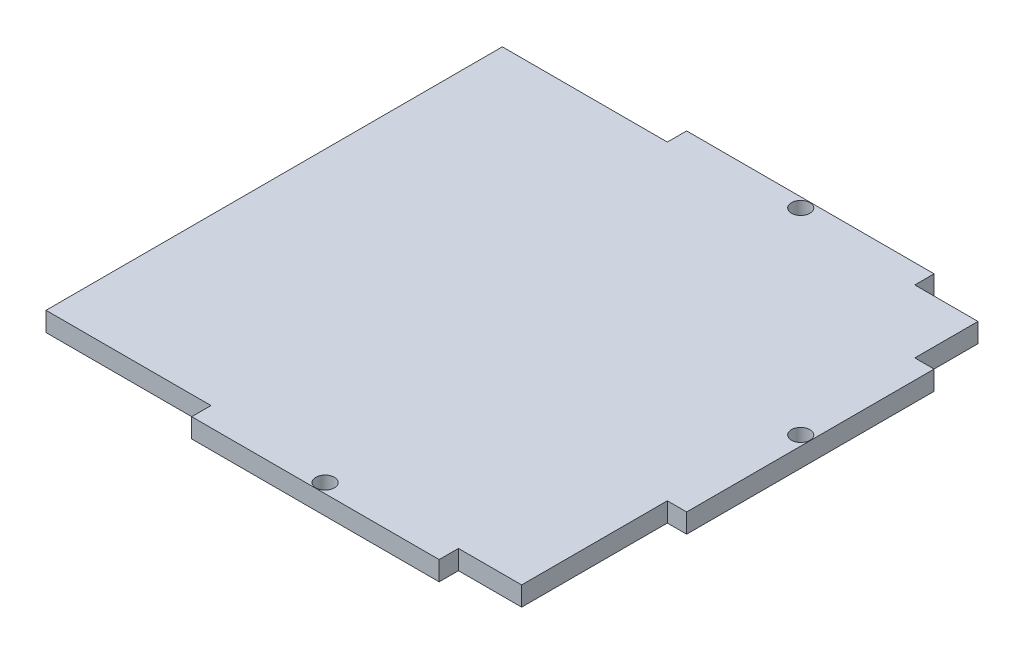
ISO-10303-21;
HEADER;
FILE_DESCRIPTION(('STEP AP214'),'2;1');
FILE_NAME('part.step','',(''),(''),'','','');
FILE_SCHEMA(('AUTOMOTIVE_DESIGN { 1 0 10303 214 1 1 1 1 }'));
ENDSEC;
DATA;
#1=APPLICATION_CONTEXT('core data for automotive mechanical design processes');
#2=APPLICATION_PROTOCOL_DEFINITION('international standard','automotive_design',2000,#1);
#3=PRODUCT_CONTEXT('',#1,'mechanical');
#4=PRODUCT('Part','Part','',(#3));
#5=PRODUCT_RELATED_PRODUCT_CATEGORY('part','',(#4));
#6=PRODUCT_DEFINITION_FORMATION('','',#4);
#7=PRODUCT_DEFINITION_CONTEXT('part definition',#1,'design');
#8=PRODUCT_DEFINITION('design','',#6,#7);
#9=PRODUCT_DEFINITION_SHAPE('','',#8);
#10=(LENGTH_UNIT() NAMED_UNIT(*) SI_UNIT(.MILLI.,.METRE.));
#11=(NAMED_UNIT(*) PLANE_ANGLE_UNIT() SI_UNIT($,.RADIAN.));
#12=(NAMED_UNIT(*) SI_UNIT($,.STERADIAN.) SOLID_ANGLE_UNIT());
#13=UNCERTAINTY_MEASURE_WITH_UNIT(LENGTH_MEASURE(1.E-05),#10,'distance_accuracy_value','');
#14=(GEOMETRIC_REPRESENTATION_CONTEXT(3) GLOBAL_UNCERTAINTY_ASSIGNED_CONTEXT((#13)) GLOBAL_UNIT_ASSIGNED_CONTEXT((#10,
#11,#12)) REPRESENTATION_CONTEXT('',''));
#15=CARTESIAN_POINT('',(0.,0.,0.));
#16=DIRECTION('',(0.,0.,1.));
#17=DIRECTION('',(1.,0.,0.));
#18=AXIS2_PLACEMENT_3D('',#15,#16,#17);
#19=CARTESIAN_POINT('',(38.1,2.9718,38.1));
#20=DIRECTION('',(-1.,0.,0.));
#21=DIRECTION('',(0.,0.,1.));
#22=AXIS2_PLACEMENT_3D('',#19,#20,#21);
#23=PLANE('',#22);
#24=DIRECTION('',(0.,0.,-1.));
#25=VECTOR('',#24,1.);
#26=CARTESIAN_POINT('',(38.1,2.9718,38.1));
#27=LINE('',#26,#25);
#28=CARTESIAN_POINT('',(38.1,2.9718,12.7));
#29=VERTEX_POINT('',#28);
#30=CARTESIAN_POINT('',(38.1,2.9718,-25.4));
#31=VERTEX_POINT('',#30);
#32=EDGE_CURVE('E226',#29,#31,#27,.T.);
#33=ORIENTED_EDGE('',*,*,#32,.F.);
#34=DIRECTION('',(0.,1.,0.));
#35=VECTOR('',#34,1.);
#36=CARTESIAN_POINT('',(38.1,0.,12.7));
#37=LINE('',#36,#35);
#38=CARTESIAN_POINT('',(38.1,0.,12.7));
#39=VERTEX_POINT('',#38);
#40=EDGE_CURVE('E286',#39,#29,#37,.T.);
#41=ORIENTED_EDGE('',*,*,#40,.F.);
#42=DIRECTION('',(0.,0.,-1.));
#43=VECTOR('',#42,1.);
#44=CARTESIAN_POINT('',(38.1,0.,38.1));
#45=LINE('',#44,#43);
#46=CARTESIAN_POINT('',(38.1,0.,-25.4));
#47=VERTEX_POINT('',#46);
#48=EDGE_CURVE('E230',#39,#47,#45,.T.);
#49=ORIENTED_EDGE('',*,*,#48,.T.);
#50=DIRECTION('',(0.,1.,0.));
#51=VECTOR('',#50,1.);
#52=CARTESIAN_POINT('',(38.1,0.,-25.4));
#53=LINE('',#52,#51);
#54=EDGE_CURVE('E317',#47,#31,#53,.T.);
#55=ORIENTED_EDGE('',*,*,#54,.T.);
#56=EDGE_LOOP('',(#33,#41,#49,#55));
#57=FACE_BOUND('',#56,.T.);
#58=ADVANCED_FACE('F81',(#57),#23,.F.);
#59=CARTESIAN_POINT('',(-38.1,2.9718,-38.1));
#60=DIRECTION('',(0.,0.,1.));
#61=DIRECTION('',(1.,0.,0.));
#62=AXIS2_PLACEMENT_3D('',#59,#60,#61);
#63=PLANE('',#62);
#64=DIRECTION('',(-1.,0.,0.));
#65=VECTOR('',#64,1.);
#66=CARTESIAN_POINT('',(-38.1,2.9718,-38.1));
#67=LINE('',#66,#65);
#68=CARTESIAN_POINT('',(25.4,2.9718,-38.1));
#69=VERTEX_POINT('',#68);
#70=CARTESIAN_POINT('',(-12.7,2.9718,-38.1));
#71=VERTEX_POINT('',#70);
#72=EDGE_CURVE('E223',#69,#71,#67,.T.);
#73=ORIENTED_EDGE('',*,*,#72,.F.);
#74=DIRECTION('',(0.,1.,0.));
#75=VECTOR('',#74,1.);
#76=CARTESIAN_POINT('',(25.4,0.,-38.1));
#77=LINE('',#76,#75);
#78=CARTESIAN_POINT('',(25.4,0.,-38.1));
#79=VERTEX_POINT('',#78);
#80=EDGE_CURVE('E313',#79,#69,#77,.T.);
#81=ORIENTED_EDGE('',*,*,#80,.F.);
#82=DIRECTION('',(-1.,0.,0.));
#83=VECTOR('',#82,1.);
#84=CARTESIAN_POINT('',(-38.1,0.,-38.1));
#85=LINE('',#84,#83);
#86=CARTESIAN_POINT('',(-12.7,0.,-38.1));
#87=VERTEX_POINT('',#86);
#88=EDGE_CURVE('E233',#79,#87,#85,.T.);
#89=ORIENTED_EDGE('',*,*,#88,.T.);
#90=DIRECTION('',(0.,1.,0.));
#91=VECTOR('',#90,1.);
#92=CARTESIAN_POINT('',(-12.7,0.,-38.1));
#93=LINE('',#92,#91);
#94=EDGE_CURVE('E246',#87,#71,#93,.T.);
#95=ORIENTED_EDGE('',*,*,#94,.T.);
#96=EDGE_LOOP('',(#73,#81,#89,#95));
#97=FACE_BOUND('',#96,.T.);
#98=ADVANCED_FACE('F385',(#97),#63,.F.);
#99=CARTESIAN_POINT('',(-38.1,2.9718,38.1));
#100=DIRECTION('',(1.,0.,0.));
#101=DIRECTION('',(0.,0.,-1.));
#102=AXIS2_PLACEMENT_3D('',#99,#100,#101);
#103=PLANE('',#102);
#104=DIRECTION('',(0.,1.,0.));
#105=VECTOR('',#104,1.);
#106=CARTESIAN_POINT('',(-38.1,0.,35.1282));
#107=LINE('',#106,#105);
#108=CARTESIAN_POINT('',(-38.1,0.,35.1282));
#109=VERTEX_POINT('',#108);
#110=CARTESIAN_POINT('',(-38.1,2.9718,35.1282));
#111=VERTEX_POINT('',#110);
#112=EDGE_CURVE('E198',#109,#111,#107,.T.);
#113=ORIENTED_EDGE('',*,*,#112,.T.);
#114=DIRECTION('',(0.,0.,1.));
#115=VECTOR('',#114,1.);
#116=CARTESIAN_POINT('',(-38.1,2.9718,38.1));
#117=LINE('',#116,#115);
#118=CARTESIAN_POINT('',(-38.1,2.9718,-35.1282));
#119=VERTEX_POINT('',#118);
#120=EDGE_CURVE('E89',#119,#111,#117,.T.);
#121=ORIENTED_EDGE('',*,*,#120,.F.);
#122=DIRECTION('',(0.,1.,0.));
#123=VECTOR('',#122,1.);
#124=CARTESIAN_POINT('',(-38.1,0.,-35.1282));
#125=LINE('',#124,#123);
#126=CARTESIAN_POINT('',(-38.1,0.,-35.1282));
#127=VERTEX_POINT('',#126);
#128=EDGE_CURVE('E249',#127,#119,#125,.T.);
#129=ORIENTED_EDGE('',*,*,#128,.F.);
#130=DIRECTION('',(0.,0.,1.));
#131=VECTOR('',#130,1.);
#132=CARTESIAN_POINT('',(-38.1,0.,38.1));
#133=LINE('',#132,#131);
#134=EDGE_CURVE('E212',#127,#109,#133,.T.);
#135=ORIENTED_EDGE('',*,*,#134,.T.);
#136=EDGE_LOOP('',(#113,#121,#129,#135));
#137=FACE_BOUND('',#136,.T.);
#138=ADVANCED_FACE('F209',(#137),#103,.F.);
#139=CARTESIAN_POINT('',(-38.1,2.9718,38.1));
#140=DIRECTION('',(0.,0.,-1.));
#141=DIRECTION('',(-1.,0.,0.));
#142=AXIS2_PLACEMENT_3D('',#139,#140,#141);
#143=PLANE('',#142);
#144=DIRECTION('',(0.,1.,0.));
#145=VECTOR('',#144,1.);
#146=CARTESIAN_POINT('',(25.4,0.,38.1));
#147=LINE('',#146,#145);
#148=CARTESIAN_POINT('',(25.4,0.,38.1));
#149=VERTEX_POINT('',#148);
#150=CARTESIAN_POINT('',(25.4,2.9718,38.1));
#151=VERTEX_POINT('',#150);
#152=EDGE_CURVE('E289',#149,#151,#147,.T.);
#153=ORIENTED_EDGE('',*,*,#152,.T.);
#154=DIRECTION('',(1.,0.,0.));
#155=VECTOR('',#154,1.);
#156=CARTESIAN_POINT('',(-38.1,2.9718,38.1));
#157=LINE('',#156,#155);
#158=CARTESIAN_POINT('',(-12.7,2.9718,38.1));
#159=VERTEX_POINT('',#158);
#160=EDGE_CURVE('E12',#159,#151,#157,.T.);
#161=ORIENTED_EDGE('',*,*,#160,.F.);
#162=DIRECTION('',(0.,1.,0.));
#163=VECTOR('',#162,1.);
#164=CARTESIAN_POINT('',(-12.7,0.,38.1));
#165=LINE('',#164,#163);
#166=CARTESIAN_POINT('',(-12.7,0.,38.1));
#167=VERTEX_POINT('',#166);
#168=EDGE_CURVE('E214',#167,#159,#165,.T.);
#169=ORIENTED_EDGE('',*,*,#168,.F.);
#170=DIRECTION('',(1.,0.,0.));
#171=VECTOR('',#170,1.);
#172=CARTESIAN_POINT('',(-38.1,0.,38.1));
#173=LINE('',#172,#171);
#174=EDGE_CURVE('E84',#167,#149,#173,.T.);
#175=ORIENTED_EDGE('',*,*,#174,.T.);
#176=EDGE_LOOP('',(#153,#161,#169,#175));
#177=FACE_BOUND('',#176,.T.);
#178=ADVANCED_FACE('F348',(#177),#143,.F.);
#179=CARTESIAN_POINT('',(0.,2.9718,0.));
#180=DIRECTION('',(0.,-1.,0.));
#181=DIRECTION('',(0.,0.,-1.));
#182=AXIS2_PLACEMENT_3D('',#179,#180,#181);
#183=PLANE('',#182);
#184=DIRECTION('',(0.,0.,-1.));
#185=VECTOR('',#184,1.);
#186=CARTESIAN_POINT('',(35.1282,2.9718,38.1));
#187=LINE('',#186,#185);
#188=CARTESIAN_POINT('',(35.1282,2.9718,35.1282));
#189=VERTEX_POINT('',#188);
#190=CARTESIAN_POINT('',(35.1282,2.9718,12.7));
#191=VERTEX_POINT('',#190);
#192=EDGE_CURVE('E287',#189,#191,#187,.T.);
#193=ORIENTED_EDGE('',*,*,#192,.T.);
#194=DIRECTION('',(-1.,0.,0.));
#195=VECTOR('',#194,1.);
#196=CARTESIAN_POINT('',(38.1,2.9718,12.7));
#197=LINE('',#196,#195);
#198=EDGE_CURVE('E282',#29,#191,#197,.T.);
#199=ORIENTED_EDGE('',*,*,#198,.F.);
#200=ORIENTED_EDGE('',*,*,#32,.T.);
#201=DIRECTION('',(-1.,0.,0.));
#202=VECTOR('',#201,1.);
#203=CARTESIAN_POINT('',(38.1,2.9718,-25.4));
#204=LINE('',#203,#202);
#205=CARTESIAN_POINT('',(35.1282,2.9718,-25.4));
#206=VERTEX_POINT('',#205);
#207=EDGE_CURVE('E327',#31,#206,#204,.T.);
#208=ORIENTED_EDGE('',*,*,#207,.T.);
#209=DIRECTION('',(0.,0.,1.));
#210=VECTOR('',#209,1.);
#211=CARTESIAN_POINT('',(35.1282,2.9718,-38.1));
#212=LINE('',#211,#210);
#213=CARTESIAN_POINT('',(35.1282,2.9718,-35.1282));
#214=VERTEX_POINT('',#213);
#215=EDGE_CURVE('E332',#214,#206,#212,.T.);
#216=ORIENTED_EDGE('',*,*,#215,.F.);
#217=DIRECTION('',(-1.,0.,0.));
#218=VECTOR('',#217,1.);
#219=CARTESIAN_POINT('',(38.1,2.9718,-35.1282));
#220=LINE('',#219,#218);
#221=CARTESIAN_POINT('',(25.4,2.9718,-35.1282));
#222=VERTEX_POINT('',#221);
#223=EDGE_CURVE('E314',#214,#222,#220,.T.);
#224=ORIENTED_EDGE('',*,*,#223,.T.);
#225=DIRECTION('',(0.,0.,1.));
#226=VECTOR('',#225,1.);
#227=CARTESIAN_POINT('',(25.4,2.9718,-38.1));
#228=LINE('',#227,#226);
#229=EDGE_CURVE('E309',#69,#222,#228,.T.);
#230=ORIENTED_EDGE('',*,*,#229,.F.);
#231=ORIENTED_EDGE('',*,*,#72,.T.);
#232=DIRECTION('',(0.,0.,1.));
#233=VECTOR('',#232,1.);
#234=CARTESIAN_POINT('',(-12.7,2.9718,0.));
#235=LINE('',#234,#233);
#236=CARTESIAN_POINT('',(-12.7,2.9718,-35.1282));
#237=VERTEX_POINT('',#236);
#238=EDGE_CURVE('E255',#71,#237,#235,.T.);
#239=ORIENTED_EDGE('',*,*,#238,.T.);
#240=DIRECTION('',(1.,0.,0.));
#241=VECTOR('',#240,1.);
#242=CARTESIAN_POINT('',(0.,2.9718,-35.1282));
#243=LINE('',#242,#241);
#244=EDGE_CURVE('E222',#119,#237,#243,.T.);
#245=ORIENTED_EDGE('',*,*,#244,.F.);
#246=ORIENTED_EDGE('',*,*,#120,.T.);
#247=DIRECTION('',(1.,0.,0.));
#248=VECTOR('',#247,1.);
#249=CARTESIAN_POINT('',(-38.1,2.9718,35.1282));
#250=LINE('',#249,#248);
#251=CARTESIAN_POINT('',(-12.7,2.9718,35.1282));
#252=VERTEX_POINT('',#251);
#253=EDGE_CURVE('E195',#111,#252,#250,.T.);
#254=ORIENTED_EDGE('',*,*,#253,.T.);
#255=DIRECTION('',(0.,0.,-1.));
#256=VECTOR('',#255,1.);
#257=CARTESIAN_POINT('',(-12.7,2.9718,38.1));
#258=LINE('',#257,#256);
#259=EDGE_CURVE('E204',#159,#252,#258,.T.);
#260=ORIENTED_EDGE('',*,*,#259,.F.);
#261=ORIENTED_EDGE('',*,*,#160,.T.);
#262=DIRECTION('',(0.,0.,-1.));
#263=VECTOR('',#262,1.);
#264=CARTESIAN_POINT('',(25.4,2.9718,38.1));
#265=LINE('',#264,#263);
#266=CARTESIAN_POINT('',(25.4,2.9718,35.1282));
#267=VERTEX_POINT('',#266);
#268=EDGE_CURVE('E298',#151,#267,#265,.T.);
#269=ORIENTED_EDGE('',*,*,#268,.T.);
#270=DIRECTION('',(-1.,0.,0.));
#271=VECTOR('',#270,1.);
#272=CARTESIAN_POINT('',(38.1,2.9718,35.1282));
#273=LINE('',#272,#271);
#274=EDGE_CURVE('E257',#189,#267,#273,.T.);
#275=ORIENTED_EDGE('',*,*,#274,.F.);
#276=EDGE_LOOP('',(#193,#199,#200,#208,#216,#224,#230,#231,#239,#245,#246,#254,#260,#261,#269,#275));
#277=FACE_BOUND('',#276,.T.);
#278=CARTESIAN_POINT('',(36.6141,2.9718,-6.35000000000001));
#279=DIRECTION('',(0.,1.,0.));
#280=DIRECTION('',(0.,0.,1.));
#281=AXIS2_PLACEMENT_3D('',#278,#279,#280);
#282=CIRCLE('',#281,1.42239999999999);
#283=CARTESIAN_POINT('',(36.6141,2.9718,-4.92760000000001));
#284=VERTEX_POINT('',#283);
#285=EDGE_CURVE('E276',#284,#284,#282,.T.);
#286=ORIENTED_EDGE('',*,*,#285,.F.);
#287=EDGE_LOOP('',(#286));
#288=FACE_BOUND('',#287,.T.);
#289=CARTESIAN_POINT('',(6.35000000000001,2.9718,-36.6141));
#290=DIRECTION('',(0.,1.,0.));
#291=DIRECTION('',(0.,0.,1.));
#292=AXIS2_PLACEMENT_3D('',#289,#290,#291);
#293=CIRCLE('',#292,1.4224);
#294=CARTESIAN_POINT('',(6.35000000000001,2.9718,-35.1917));
#295=VERTEX_POINT('',#294);
#296=EDGE_CURVE('E270',#295,#295,#293,.T.);
#297=ORIENTED_EDGE('',*,*,#296,.F.);
#298=EDGE_LOOP('',(#297));
#299=FACE_BOUND('',#298,.T.);
#300=CARTESIAN_POINT('',(6.35000000000001,2.9718,36.6141));
#301=DIRECTION('',(0.,1.,0.));
#302=DIRECTION('',(0.,0.,1.));
#303=AXIS2_PLACEMENT_3D('',#300,#301,#302);
#304=CIRCLE('',#303,1.4224);
#305=CARTESIAN_POINT('',(6.35000000000001,2.9718,38.0365));
#306=VERTEX_POINT('',#305);
#307=EDGE_CURVE('E264',#306,#306,#304,.T.);
#308=ORIENTED_EDGE('',*,*,#307,.F.);
#309=EDGE_LOOP('',(#308));
#310=FACE_BOUND('',#309,.T.);
#311=ADVANCED_FACE('F218',(#277,#288,#299,#310),#183,.F.);
#312=CARTESIAN_POINT('',(0.,0.,0.));
#313=DIRECTION('',(0.,-1.,0.));
#314=DIRECTION('',(0.,0.,-1.));
#315=AXIS2_PLACEMENT_3D('',#312,#313,#314);
#316=PLANE('',#315);
#317=DIRECTION('',(-1.,0.,0.));
#318=VECTOR('',#317,1.);
#319=CARTESIAN_POINT('',(38.1,0.,12.7));
#320=LINE('',#319,#318);
#321=CARTESIAN_POINT('',(35.1282,0.,12.7));
#322=VERTEX_POINT('',#321);
#323=EDGE_CURVE('E283',#39,#322,#320,.T.);
#324=ORIENTED_EDGE('',*,*,#323,.T.);
#325=DIRECTION('',(0.,0.,-1.));
#326=VECTOR('',#325,1.);
#327=CARTESIAN_POINT('',(35.1282,0.,38.1));
#328=LINE('',#327,#326);
#329=CARTESIAN_POINT('',(35.1282,0.,35.1282));
#330=VERTEX_POINT('',#329);
#331=EDGE_CURVE('E280',#330,#322,#328,.T.);
#332=ORIENTED_EDGE('',*,*,#331,.F.);
#333=DIRECTION('',(-1.,0.,0.));
#334=VECTOR('',#333,1.);
#335=CARTESIAN_POINT('',(38.1,0.,35.1282));
#336=LINE('',#335,#334);
#337=CARTESIAN_POINT('',(25.4,0.,35.1282));
#338=VERTEX_POINT('',#337);
#339=EDGE_CURVE('E295',#330,#338,#336,.T.);
#340=ORIENTED_EDGE('',*,*,#339,.T.);
#341=DIRECTION('',(0.,0.,-1.));
#342=VECTOR('',#341,1.);
#343=CARTESIAN_POINT('',(25.4,0.,38.1));
#344=LINE('',#343,#342);
#345=EDGE_CURVE('E299',#149,#338,#344,.T.);
#346=ORIENTED_EDGE('',*,*,#345,.F.);
#347=ORIENTED_EDGE('',*,*,#174,.F.);
#348=DIRECTION('',(0.,0.,-1.));
#349=VECTOR('',#348,1.);
#350=CARTESIAN_POINT('',(-12.7,0.,38.1));
#351=LINE('',#350,#349);
#352=CARTESIAN_POINT('',(-12.7,0.,35.1282));
#353=VERTEX_POINT('',#352);
#354=EDGE_CURVE('E213',#167,#353,#351,.T.);
#355=ORIENTED_EDGE('',*,*,#354,.T.);
#356=DIRECTION('',(1.,0.,0.));
#357=VECTOR('',#356,1.);
#358=CARTESIAN_POINT('',(-38.1,0.,35.1282));
#359=LINE('',#358,#357);
#360=EDGE_CURVE('E340',#109,#353,#359,.T.);
#361=ORIENTED_EDGE('',*,*,#360,.F.);
#362=ORIENTED_EDGE('',*,*,#134,.F.);
#363=DIRECTION('',(1.,0.,0.));
#364=VECTOR('',#363,1.);
#365=CARTESIAN_POINT('',(0.,0.,-35.1282));
#366=LINE('',#365,#364);
#367=CARTESIAN_POINT('',(-12.7,0.,-35.1282));
#368=VERTEX_POINT('',#367);
#369=EDGE_CURVE('E250',#127,#368,#366,.T.);
#370=ORIENTED_EDGE('',*,*,#369,.T.);
#371=DIRECTION('',(0.,0.,1.));
#372=VECTOR('',#371,1.);
#373=CARTESIAN_POINT('',(-12.7,0.,0.));
#374=LINE('',#373,#372);
#375=EDGE_CURVE('E254',#87,#368,#374,.T.);
#376=ORIENTED_EDGE('',*,*,#375,.F.);
#377=ORIENTED_EDGE('',*,*,#88,.F.);
#378=DIRECTION('',(0.,0.,1.));
#379=VECTOR('',#378,1.);
#380=CARTESIAN_POINT('',(25.4,0.,-38.1));
#381=LINE('',#380,#379);
#382=CARTESIAN_POINT('',(25.4,0.,-35.1282));
#383=VERTEX_POINT('',#382);
#384=EDGE_CURVE('E310',#79,#383,#381,.T.);
#385=ORIENTED_EDGE('',*,*,#384,.T.);
#386=DIRECTION('',(-1.,0.,0.));
#387=VECTOR('',#386,1.);
#388=CARTESIAN_POINT('',(38.1,0.,-35.1282));
#389=LINE('',#388,#387);
#390=CARTESIAN_POINT('',(35.1282,0.,-35.1282));
#391=VERTEX_POINT('',#390);
#392=EDGE_CURVE('E307',#391,#383,#389,.T.);
#393=ORIENTED_EDGE('',*,*,#392,.F.);
#394=DIRECTION('',(0.,0.,1.));
#395=VECTOR('',#394,1.);
#396=CARTESIAN_POINT('',(35.1282,0.,-38.1));
#397=LINE('',#396,#395);
#398=CARTESIAN_POINT('',(35.1282,0.,-25.4));
#399=VERTEX_POINT('',#398);
#400=EDGE_CURVE('E324',#391,#399,#397,.T.);
#401=ORIENTED_EDGE('',*,*,#400,.T.);
#402=DIRECTION('',(-1.,0.,0.));
#403=VECTOR('',#402,1.);
#404=CARTESIAN_POINT('',(38.1,0.,-25.4));
#405=LINE('',#404,#403);
#406=EDGE_CURVE('E328',#47,#399,#405,.T.);
#407=ORIENTED_EDGE('',*,*,#406,.F.);
#408=ORIENTED_EDGE('',*,*,#48,.F.);
#409=EDGE_LOOP('',(#324,#332,#340,#346,#347,#355,#361,#362,#370,#376,#377,#385,#393,#401,#407,#408));
#410=FACE_BOUND('',#409,.T.);
#411=CARTESIAN_POINT('',(36.6141,0.,-6.35000000000001));
#412=DIRECTION('',(0.,1.,0.));
#413=DIRECTION('',(0.,0.,1.));
#414=AXIS2_PLACEMENT_3D('',#411,#412,#413);
#415=CIRCLE('',#414,1.42239999999999);
#416=CARTESIAN_POINT('',(36.6141,0.,-4.92760000000001));
#417=VERTEX_POINT('',#416);
#418=EDGE_CURVE('E273',#417,#417,#415,.T.);
#419=ORIENTED_EDGE('',*,*,#418,.T.);
#420=EDGE_LOOP('',(#419));
#421=FACE_BOUND('',#420,.T.);
#422=CARTESIAN_POINT('',(6.35000000000001,0.,-36.6141));
#423=DIRECTION('',(0.,1.,0.));
#424=DIRECTION('',(0.,0.,1.));
#425=AXIS2_PLACEMENT_3D('',#422,#423,#424);
#426=CIRCLE('',#425,1.4224);
#427=CARTESIAN_POINT('',(6.35000000000001,0.,-35.1917));
#428=VERTEX_POINT('',#427);
#429=EDGE_CURVE('E267',#428,#428,#426,.T.);
#430=ORIENTED_EDGE('',*,*,#429,.T.);
#431=EDGE_LOOP('',(#430));
#432=FACE_BOUND('',#431,.T.);
#433=CARTESIAN_POINT('',(6.35000000000001,0.,36.6141));
#434=DIRECTION('',(0.,1.,0.));
#435=DIRECTION('',(0.,0.,1.));
#436=AXIS2_PLACEMENT_3D('',#433,#434,#435);
#437=CIRCLE('',#436,1.4224);
#438=CARTESIAN_POINT('',(6.35000000000001,0.,38.0365));
#439=VERTEX_POINT('',#438);
#440=EDGE_CURVE('E203',#439,#439,#437,.T.);
#441=ORIENTED_EDGE('',*,*,#440,.T.);
#442=EDGE_LOOP('',(#441));
#443=FACE_BOUND('',#442,.T.);
#444=ADVANCED_FACE('F353',(#410,#421,#432,#443),#316,.T.);
#445=CARTESIAN_POINT('',(-12.7,0.,0.));
#446=DIRECTION('',(-1.,0.,0.));
#447=DIRECTION('',(0.,0.,1.));
#448=AXIS2_PLACEMENT_3D('',#445,#446,#447);
#449=PLANE('',#448);
#450=ORIENTED_EDGE('',*,*,#238,.F.);
#451=ORIENTED_EDGE('',*,*,#94,.F.);
#452=ORIENTED_EDGE('',*,*,#375,.T.);
#453=DIRECTION('',(0.,1.,0.));
#454=VECTOR('',#453,1.);
#455=CARTESIAN_POINT('',(-12.7,0.,-35.1282));
#456=LINE('',#455,#454);
#457=EDGE_CURVE('E234',#368,#237,#456,.T.);
#458=ORIENTED_EDGE('',*,*,#457,.T.);
#459=EDGE_LOOP('',(#450,#451,#452,#458));
#460=FACE_BOUND('',#459,.T.);
#461=ADVANCED_FACE('F388',(#460),#449,.T.);
#462=CARTESIAN_POINT('',(0.,0.,-35.1282));
#463=DIRECTION('',(0.,0.,1.));
#464=DIRECTION('',(1.,0.,0.));
#465=AXIS2_PLACEMENT_3D('',#462,#463,#464);
#466=PLANE('',#465);
#467=ORIENTED_EDGE('',*,*,#244,.T.);
#468=ORIENTED_EDGE('',*,*,#457,.F.);
#469=ORIENTED_EDGE('',*,*,#369,.F.);
#470=ORIENTED_EDGE('',*,*,#128,.T.);
#471=EDGE_LOOP('',(#467,#468,#469,#470));
#472=FACE_BOUND('',#471,.T.);
#473=ADVANCED_FACE('F390',(#472),#466,.F.);
#474=CARTESIAN_POINT('',(38.1,0.,-35.1282));
#475=DIRECTION('',(0.,0.,-1.));
#476=DIRECTION('',(-1.,0.,0.));
#477=AXIS2_PLACEMENT_3D('',#474,#475,#476);
#478=PLANE('',#477);
#479=ORIENTED_EDGE('',*,*,#392,.T.);
#480=DIRECTION('',(0.,1.,0.));
#481=VECTOR('',#480,1.);
#482=CARTESIAN_POINT('',(25.4,0.,-35.1282));
#483=LINE('',#482,#481);
#484=EDGE_CURVE('E321',#383,#222,#483,.T.);
#485=ORIENTED_EDGE('',*,*,#484,.T.);
#486=ORIENTED_EDGE('',*,*,#223,.F.);
#487=DIRECTION('',(0.,1.,0.));
#488=VECTOR('',#487,1.);
#489=CARTESIAN_POINT('',(35.1282,0.,-35.1282));
#490=LINE('',#489,#488);
#491=EDGE_CURVE('E323',#391,#214,#490,.T.);
#492=ORIENTED_EDGE('',*,*,#491,.F.);
#493=EDGE_LOOP('',(#479,#485,#486,#492));
#494=FACE_BOUND('',#493,.T.);
#495=ADVANCED_FACE('F378',(#494),#478,.T.);
#496=CARTESIAN_POINT('',(25.4,0.,-38.1));
#497=DIRECTION('',(-1.,0.,0.));
#498=DIRECTION('',(0.,0.,1.));
#499=AXIS2_PLACEMENT_3D('',#496,#497,#498);
#500=PLANE('',#499);
#501=ORIENTED_EDGE('',*,*,#229,.T.);
#502=ORIENTED_EDGE('',*,*,#484,.F.);
#503=ORIENTED_EDGE('',*,*,#384,.F.);
#504=ORIENTED_EDGE('',*,*,#80,.T.);
#505=EDGE_LOOP('',(#501,#502,#503,#504));
#506=FACE_BOUND('',#505,.T.);
#507=ADVANCED_FACE('F381',(#506),#500,.F.);
#508=CARTESIAN_POINT('',(38.1,0.,-25.4));
#509=DIRECTION('',(0.,0.,-1.));
#510=DIRECTION('',(-1.,0.,0.));
#511=AXIS2_PLACEMENT_3D('',#508,#509,#510);
#512=PLANE('',#511);
#513=ORIENTED_EDGE('',*,*,#207,.F.);
#514=ORIENTED_EDGE('',*,*,#54,.F.);
#515=ORIENTED_EDGE('',*,*,#406,.T.);
#516=DIRECTION('',(0.,1.,0.));
#517=VECTOR('',#516,1.);
#518=CARTESIAN_POINT('',(35.1282,0.,-25.4));
#519=LINE('',#518,#517);
#520=EDGE_CURVE('E331',#399,#206,#519,.T.);
#521=ORIENTED_EDGE('',*,*,#520,.T.);
#522=EDGE_LOOP('',(#513,#514,#515,#521));
#523=FACE_BOUND('',#522,.T.);
#524=ADVANCED_FACE('F368',(#523),#512,.T.);
#525=CARTESIAN_POINT('',(35.1282,0.,-38.1));
#526=DIRECTION('',(-1.,0.,0.));
#527=DIRECTION('',(0.,0.,1.));
#528=AXIS2_PLACEMENT_3D('',#525,#526,#527);
#529=PLANE('',#528);
#530=ORIENTED_EDGE('',*,*,#491,.T.);
#531=ORIENTED_EDGE('',*,*,#215,.T.);
#532=ORIENTED_EDGE('',*,*,#520,.F.);
#533=ORIENTED_EDGE('',*,*,#400,.F.);
#534=EDGE_LOOP('',(#530,#531,#532,#533));
#535=FACE_BOUND('',#534,.T.);
#536=ADVANCED_FACE('F372',(#535),#529,.F.);
#537=CARTESIAN_POINT('',(-38.1,0.,35.1282));
#538=DIRECTION('',(0.,0.,1.));
#539=DIRECTION('',(1.,0.,0.));
#540=AXIS2_PLACEMENT_3D('',#537,#538,#539);
#541=PLANE('',#540);
#542=ORIENTED_EDGE('',*,*,#253,.F.);
#543=ORIENTED_EDGE('',*,*,#112,.F.);
#544=ORIENTED_EDGE('',*,*,#360,.T.);
#545=DIRECTION('',(0.,1.,0.));
#546=VECTOR('',#545,1.);
#547=CARTESIAN_POINT('',(-12.7,0.,35.1282));
#548=LINE('',#547,#546);
#549=EDGE_CURVE('E105',#353,#252,#548,.T.);
#550=ORIENTED_EDGE('',*,*,#549,.T.);
#551=EDGE_LOOP('',(#542,#543,#544,#550));
#552=FACE_BOUND('',#551,.T.);
#553=ADVANCED_FACE('F197',(#552),#541,.T.);
#554=CARTESIAN_POINT('',(-12.7,0.,38.1));
#555=DIRECTION('',(1.,0.,0.));
#556=DIRECTION('',(0.,0.,-1.));
#557=AXIS2_PLACEMENT_3D('',#554,#555,#556);
#558=PLANE('',#557);
#559=ORIENTED_EDGE('',*,*,#259,.T.);
#560=ORIENTED_EDGE('',*,*,#549,.F.);
#561=ORIENTED_EDGE('',*,*,#354,.F.);
#562=ORIENTED_EDGE('',*,*,#168,.T.);
#563=EDGE_LOOP('',(#559,#560,#561,#562));
#564=FACE_BOUND('',#563,.T.);
#565=ADVANCED_FACE('F346',(#564),#558,.F.);
#566=CARTESIAN_POINT('',(6.35000000000001,0.,36.6141));
#567=DIRECTION('',(0.,1.,0.));
#568=DIRECTION('',(0.,0.,1.));
#569=AXIS2_PLACEMENT_3D('',#566,#567,#568);
#570=CYLINDRICAL_SURFACE('',#569,1.4224);
#571=ORIENTED_EDGE('',*,*,#440,.F.);
#572=EDGE_LOOP('',(#571));
#573=FACE_BOUND('',#572,.T.);
#574=ORIENTED_EDGE('',*,*,#307,.T.);
#575=EDGE_LOOP('',(#574));
#576=FACE_BOUND('',#575,.T.);
#577=ADVANCED_FACE('F478',(#573,#576),#570,.F.);
#578=CARTESIAN_POINT('',(6.35000000000001,0.,-36.6141));
#579=DIRECTION('',(0.,1.,0.));
#580=DIRECTION('',(0.,0.,1.));
#581=AXIS2_PLACEMENT_3D('',#578,#579,#580);
#582=CYLINDRICAL_SURFACE('',#581,1.4224);
#583=ORIENTED_EDGE('',*,*,#429,.F.);
#584=EDGE_LOOP('',(#583));
#585=FACE_BOUND('',#584,.T.);
#586=ORIENTED_EDGE('',*,*,#296,.T.);
#587=EDGE_LOOP('',(#586));
#588=FACE_BOUND('',#587,.T.);
#589=ADVANCED_FACE('F487',(#585,#588),#582,.F.);
#590=CARTESIAN_POINT('',(36.6141,0.,-6.35000000000001));
#591=DIRECTION('',(0.,1.,0.));
#592=DIRECTION('',(0.,0.,1.));
#593=AXIS2_PLACEMENT_3D('',#590,#591,#592);
#594=CYLINDRICAL_SURFACE('',#593,1.42239999999999);
#595=ORIENTED_EDGE('',*,*,#418,.F.);
#596=EDGE_LOOP('',(#595));
#597=FACE_BOUND('',#596,.T.);
#598=ORIENTED_EDGE('',*,*,#285,.T.);
#599=EDGE_LOOP('',(#598));
#600=FACE_BOUND('',#599,.T.);
#601=ADVANCED_FACE('F496',(#597,#600),#594,.F.);
#602=CARTESIAN_POINT('',(35.1282,0.,38.1));
#603=DIRECTION('',(1.,0.,0.));
#604=DIRECTION('',(0.,0.,-1.));
#605=AXIS2_PLACEMENT_3D('',#602,#603,#604);
#606=PLANE('',#605);
#607=ORIENTED_EDGE('',*,*,#331,.T.);
#608=DIRECTION('',(0.,1.,0.));
#609=VECTOR('',#608,1.);
#610=CARTESIAN_POINT('',(35.1282,0.,12.7));
#611=LINE('',#610,#609);
#612=EDGE_CURVE('E293',#322,#191,#611,.T.);
#613=ORIENTED_EDGE('',*,*,#612,.T.);
#614=ORIENTED_EDGE('',*,*,#192,.F.);
#615=DIRECTION('',(0.,1.,0.));
#616=VECTOR('',#615,1.);
#617=CARTESIAN_POINT('',(35.1282,0.,35.1282));
#618=LINE('',#617,#616);
#619=EDGE_CURVE('E279',#330,#189,#618,.T.);
#620=ORIENTED_EDGE('',*,*,#619,.F.);
#621=EDGE_LOOP('',(#607,#613,#614,#620));
#622=FACE_BOUND('',#621,.T.);
#623=ADVANCED_FACE('F360',(#622),#606,.T.);
#624=CARTESIAN_POINT('',(38.1,0.,12.7));
#625=DIRECTION('',(0.,0.,-1.));
#626=DIRECTION('',(-1.,0.,0.));
#627=AXIS2_PLACEMENT_3D('',#624,#625,#626);
#628=PLANE('',#627);
#629=ORIENTED_EDGE('',*,*,#198,.T.);
#630=ORIENTED_EDGE('',*,*,#612,.F.);
#631=ORIENTED_EDGE('',*,*,#323,.F.);
#632=ORIENTED_EDGE('',*,*,#40,.T.);
#633=EDGE_LOOP('',(#629,#630,#631,#632));
#634=FACE_BOUND('',#633,.T.);
#635=ADVANCED_FACE('F515',(#634),#628,.F.);
#636=CARTESIAN_POINT('',(25.4,0.,38.1));
#637=DIRECTION('',(1.,0.,0.));
#638=DIRECTION('',(0.,0.,-1.));
#639=AXIS2_PLACEMENT_3D('',#636,#637,#638);
#640=PLANE('',#639);
#641=ORIENTED_EDGE('',*,*,#268,.F.);
#642=ORIENTED_EDGE('',*,*,#152,.F.);
#643=ORIENTED_EDGE('',*,*,#345,.T.);
#644=DIRECTION('',(0.,1.,0.));
#645=VECTOR('',#644,1.);
#646=CARTESIAN_POINT('',(25.4,0.,35.1282));
#647=LINE('',#646,#645);
#648=EDGE_CURVE('E97',#338,#267,#647,.T.);
#649=ORIENTED_EDGE('',*,*,#648,.T.);
#650=EDGE_LOOP('',(#641,#642,#643,#649));
#651=FACE_BOUND('',#650,.T.);
#652=ADVANCED_FACE('F351',(#651),#640,.T.);
#653=CARTESIAN_POINT('',(38.1,0.,35.1282));
#654=DIRECTION('',(0.,0.,-1.));
#655=DIRECTION('',(-1.,0.,0.));
#656=AXIS2_PLACEMENT_3D('',#653,#654,#655);
#657=PLANE('',#656);
#658=ORIENTED_EDGE('',*,*,#619,.T.);
#659=ORIENTED_EDGE('',*,*,#274,.T.);
#660=ORIENTED_EDGE('',*,*,#648,.F.);
#661=ORIENTED_EDGE('',*,*,#339,.F.);
#662=EDGE_LOOP('',(#658,#659,#660,#661));
#663=FACE_BOUND('',#662,.T.);
#664=ADVANCED_FACE('F356',(#663),#657,.F.);
#665=CLOSED_SHELL('',(#58,#98,#138,#178,#311,#444,#461,#473,#495,#507,#524,#536,#553,#565,#577,
#589,#601,#623,#635,#652,#664));
#666=MANIFOLD_SOLID_BREP('B2',#665);
#667=ADVANCED_BREP_SHAPE_REPRESENTATION('',(#18,#666),#14);
#668=SHAPE_DEFINITION_REPRESENTATION(#9,#667);
ENDSEC;
END-ISO-10303-21;
